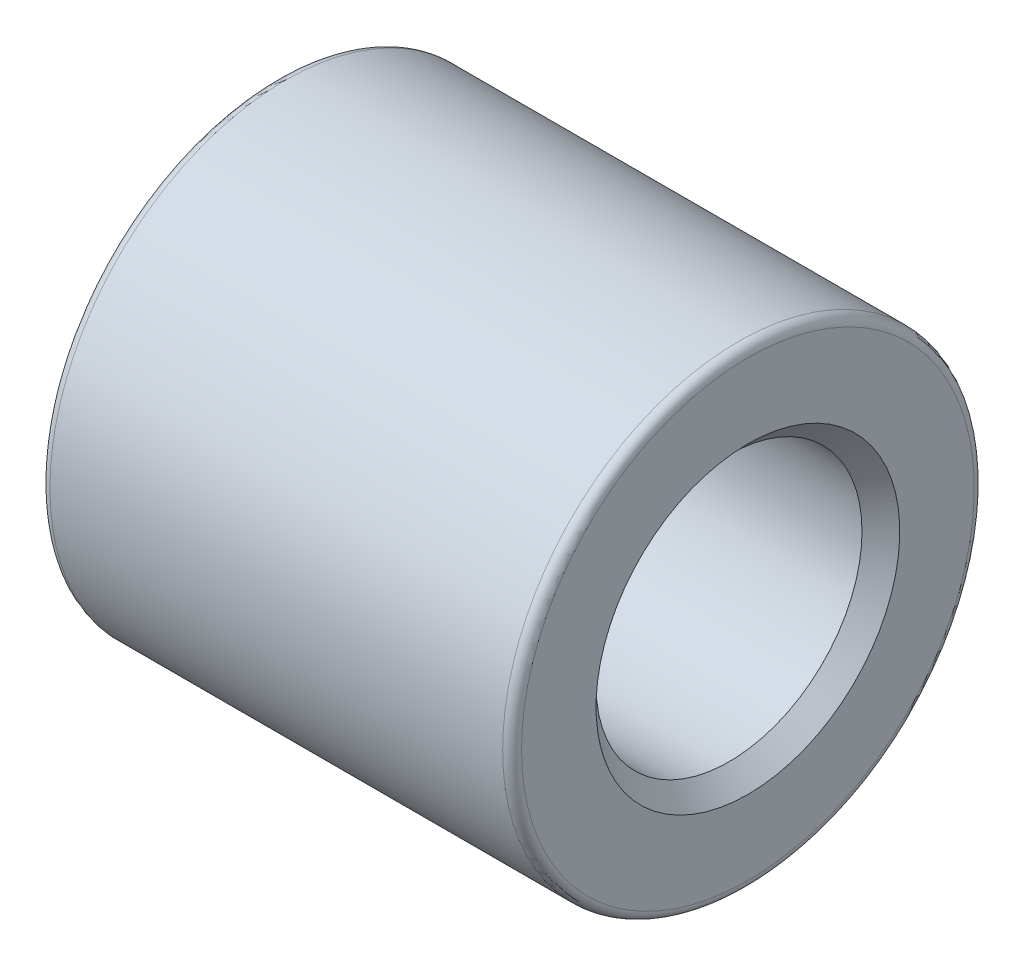
ISO-10303-21;
HEADER;
FILE_DESCRIPTION(('STEP AP214'),'2;1');
FILE_NAME('part.step','',(''),(''),'','','');
FILE_SCHEMA(('AUTOMOTIVE_DESIGN { 1 0 10303 214 1 1 1 1 }'));
ENDSEC;
DATA;
#1=APPLICATION_CONTEXT('core data for automotive mechanical design processes');
#2=APPLICATION_PROTOCOL_DEFINITION('international standard','automotive_design',2000,#1);
#3=PRODUCT_CONTEXT('',#1,'mechanical');
#4=PRODUCT('Part','Part','',(#3));
#5=PRODUCT_RELATED_PRODUCT_CATEGORY('part','',(#4));
#6=PRODUCT_DEFINITION_FORMATION('','',#4);
#7=PRODUCT_DEFINITION_CONTEXT('part definition',#1,'design');
#8=PRODUCT_DEFINITION('design','',#6,#7);
#9=PRODUCT_DEFINITION_SHAPE('','',#8);
#10=(LENGTH_UNIT() NAMED_UNIT(*) SI_UNIT(.MILLI.,.METRE.));
#11=(NAMED_UNIT(*) PLANE_ANGLE_UNIT() SI_UNIT($,.RADIAN.));
#12=(NAMED_UNIT(*) SI_UNIT($,.STERADIAN.) SOLID_ANGLE_UNIT());
#13=UNCERTAINTY_MEASURE_WITH_UNIT(LENGTH_MEASURE(1.E-05),#10,'distance_accuracy_value','');
#14=(GEOMETRIC_REPRESENTATION_CONTEXT(3) GLOBAL_UNCERTAINTY_ASSIGNED_CONTEXT((#13)) GLOBAL_UNIT_ASSIGNED_CONTEXT((#10,
#11,#12)) REPRESENTATION_CONTEXT('',''));
#15=CARTESIAN_POINT('',(0.,0.,0.));
#16=DIRECTION('',(0.,0.,1.));
#17=DIRECTION('',(1.,0.,0.));
#18=AXIS2_PLACEMENT_3D('',#15,#16,#17);
#19=CARTESIAN_POINT('',(0.,0.,0.));
#20=DIRECTION('',(-1.,0.,0.));
#21=DIRECTION('',(0.,0.,1.));
#22=AXIS2_PLACEMENT_3D('',#19,#20,#21);
#23=CYLINDRICAL_SURFACE('',#22,1.7907);
#24=CARTESIAN_POINT('',(0.253999999983989,0.,0.));
#25=DIRECTION('',(-1.,0.,0.));
#26=DIRECTION('',(0.,0.,1.));
#27=AXIS2_PLACEMENT_3D('',#24,#25,#26);
#28=CIRCLE('',#27,1.79069999995818);
#29=CARTESIAN_POINT('',(0.253999999983989,0.,1.79069999995818));
#30=VERTEX_POINT('',#29);
#31=EDGE_CURVE('E110',#30,#30,#28,.T.);
#32=ORIENTED_EDGE('',*,*,#31,.T.);
#33=EDGE_LOOP('',(#32));
#34=FACE_BOUND('',#33,.T.);
#35=CARTESIAN_POINT('',(6.09600000007049,0.,0.));
#36=DIRECTION('',(1.,0.,0.));
#37=DIRECTION('',(0.,0.,-1.));
#38=AXIS2_PLACEMENT_3D('',#35,#36,#37);
#39=CIRCLE('',#38,1.79070000001502);
#40=CARTESIAN_POINT('',(6.09600000007049,0.,-1.79070000001502));
#41=VERTEX_POINT('',#40);
#42=EDGE_CURVE('E114',#41,#41,#39,.T.);
#43=ORIENTED_EDGE('',*,*,#42,.T.);
#44=EDGE_LOOP('',(#43));
#45=FACE_BOUND('',#44,.T.);
#46=ADVANCED_FACE('F14',(#34,#45),#23,.F.);
#47=CARTESIAN_POINT('',(6.35000000005448,0.,0.));
#48=DIRECTION('',(1.,0.,0.));
#49=DIRECTION('',(0.,1.,0.));
#50=AXIS2_PLACEMENT_3D('',#47,#48,#49);
#51=CONICAL_SURFACE('',#50,2.04469999999901,0.785398163397448);
#52=CARTESIAN_POINT('',(6.35000000005448,0.,0.));
#53=DIRECTION('',(1.,0.,0.));
#54=DIRECTION('',(0.,1.,0.));
#55=AXIS2_PLACEMENT_3D('',#52,#53,#54);
#56=CIRCLE('',#55,2.04469999999901);
#57=CARTESIAN_POINT('',(6.35000000005448,2.04469999999901,0.));
#58=VERTEX_POINT('',#57);
#59=EDGE_CURVE('E17',#58,#58,#56,.T.);
#60=ORIENTED_EDGE('',*,*,#59,.T.);
#61=EDGE_LOOP('',(#60));
#62=FACE_BOUND('',#61,.T.);
#63=ORIENTED_EDGE('',*,*,#42,.F.);
#64=EDGE_LOOP('',(#63));
#65=FACE_BOUND('',#64,.T.);
#66=ADVANCED_FACE('F84',(#62,#65),#51,.F.);
#67=CARTESIAN_POINT('',(5.6843418860808E-11,0.,0.));
#68=DIRECTION('',(-1.,0.,0.));
#69=DIRECTION('',(0.,0.,1.));
#70=AXIS2_PLACEMENT_3D('',#67,#68,#69);
#71=CONICAL_SURFACE('',#70,2.04469999988532,0.785398163397448);
#72=CARTESIAN_POINT('',(0.,0.,0.));
#73=DIRECTION('',(-1.,0.,0.));
#74=DIRECTION('',(0.,0.,1.));
#75=AXIS2_PLACEMENT_3D('',#72,#73,#74);
#76=CIRCLE('',#75,2.04469999994217);
#77=CARTESIAN_POINT('',(0.,0.,2.04469999994217));
#78=VERTEX_POINT('',#77);
#79=EDGE_CURVE('E107',#78,#78,#76,.T.);
#80=ORIENTED_EDGE('',*,*,#79,.T.);
#81=EDGE_LOOP('',(#80));
#82=FACE_BOUND('',#81,.T.);
#83=ORIENTED_EDGE('',*,*,#31,.F.);
#84=EDGE_LOOP('',(#83));
#85=FACE_BOUND('',#84,.T.);
#86=ADVANCED_FACE('F80',(#82,#85),#71,.F.);
#87=CARTESIAN_POINT('',(6.35,3.175,0.));
#88=DIRECTION('',(-1.,0.,0.));
#89=DIRECTION('',(0.,0.,1.));
#90=AXIS2_PLACEMENT_3D('',#87,#88,#89);
#91=PLANE('',#90);
#92=ORIENTED_EDGE('',*,*,#59,.F.);
#93=EDGE_LOOP('',(#92));
#94=FACE_BOUND('',#93,.T.);
#95=CARTESIAN_POINT('',(6.35,0.,0.));
#96=DIRECTION('',(-1.,0.,0.));
#97=DIRECTION('',(0.,0.,1.));
#98=AXIS2_PLACEMENT_3D('',#95,#96,#97);
#99=CIRCLE('',#98,3.048);
#100=CARTESIAN_POINT('',(6.35,0.,3.048));
#101=VERTEX_POINT('',#100);
#102=EDGE_CURVE('E64',#101,#101,#99,.T.);
#103=ORIENTED_EDGE('',*,*,#102,.F.);
#104=EDGE_LOOP('',(#103));
#105=FACE_BOUND('',#104,.T.);
#106=ADVANCED_FACE('F70',(#94,#105),#91,.F.);
#107=CARTESIAN_POINT('',(0.,1.7907,0.));
#108=DIRECTION('',(1.,0.,0.));
#109=DIRECTION('',(0.,0.,-1.));
#110=AXIS2_PLACEMENT_3D('',#107,#108,#109);
#111=PLANE('',#110);
#112=ORIENTED_EDGE('',*,*,#79,.F.);
#113=EDGE_LOOP('',(#112));
#114=FACE_BOUND('',#113,.T.);
#115=CARTESIAN_POINT('',(0.,0.,0.));
#116=DIRECTION('',(1.,0.,0.));
#117=DIRECTION('',(0.,0.,-1.));
#118=AXIS2_PLACEMENT_3D('',#115,#116,#117);
#119=CIRCLE('',#118,3.048);
#120=CARTESIAN_POINT('',(0.,0.,-3.048));
#121=VERTEX_POINT('',#120);
#122=EDGE_CURVE('E26',#121,#121,#119,.T.);
#123=ORIENTED_EDGE('',*,*,#122,.F.);
#124=EDGE_LOOP('',(#123));
#125=FACE_BOUND('',#124,.T.);
#126=ADVANCED_FACE('F79',(#114,#125),#111,.F.);
#127=CARTESIAN_POINT('',(6.223,0.,0.));
#128=DIRECTION('',(-1.,0.,0.));
#129=DIRECTION('',(0.,0.,1.));
#130=AXIS2_PLACEMENT_3D('',#127,#128,#129);
#131=TOROIDAL_SURFACE('',#130,3.048,0.127);
#132=ORIENTED_EDGE('',*,*,#102,.T.);
#133=EDGE_LOOP('',(#132));
#134=FACE_BOUND('',#133,.T.);
#135=CARTESIAN_POINT('',(6.223,0.,0.));
#136=DIRECTION('',(-1.,0.,0.));
#137=DIRECTION('',(0.,0.,1.));
#138=AXIS2_PLACEMENT_3D('',#135,#136,#137);
#139=CIRCLE('',#138,3.175);
#140=CARTESIAN_POINT('',(6.223,0.,3.175));
#141=VERTEX_POINT('',#140);
#142=EDGE_CURVE('E21',#141,#141,#139,.T.);
#143=ORIENTED_EDGE('',*,*,#142,.F.);
#144=EDGE_LOOP('',(#143));
#145=FACE_BOUND('',#144,.T.);
#146=ADVANCED_FACE('F44',(#134,#145),#131,.T.);
#147=CARTESIAN_POINT('',(0.127,0.,0.));
#148=DIRECTION('',(1.,0.,0.));
#149=DIRECTION('',(0.,0.,-1.));
#150=AXIS2_PLACEMENT_3D('',#147,#148,#149);
#151=TOROIDAL_SURFACE('',#150,3.048,0.127);
#152=ORIENTED_EDGE('',*,*,#122,.T.);
#153=EDGE_LOOP('',(#152));
#154=FACE_BOUND('',#153,.T.);
#155=CARTESIAN_POINT('',(0.127,0.,0.));
#156=DIRECTION('',(-1.,0.,0.));
#157=DIRECTION('',(0.,0.,1.));
#158=AXIS2_PLACEMENT_3D('',#155,#156,#157);
#159=CIRCLE('',#158,3.175);
#160=CARTESIAN_POINT('',(0.127,0.,3.175));
#161=VERTEX_POINT('',#160);
#162=EDGE_CURVE('E10',#161,#161,#159,.F.);
#163=ORIENTED_EDGE('',*,*,#162,.F.);
#164=EDGE_LOOP('',(#163));
#165=FACE_BOUND('',#164,.T.);
#166=ADVANCED_FACE('F38',(#154,#165),#151,.T.);
#167=CARTESIAN_POINT('',(0.,0.,0.));
#168=DIRECTION('',(-1.,0.,0.));
#169=DIRECTION('',(0.,0.,1.));
#170=AXIS2_PLACEMENT_3D('',#167,#168,#169);
#171=CYLINDRICAL_SURFACE('',#170,3.175);
#172=ORIENTED_EDGE('',*,*,#162,.T.);
#173=EDGE_LOOP('',(#172));
#174=FACE_BOUND('',#173,.T.);
#175=ORIENTED_EDGE('',*,*,#142,.T.);
#176=EDGE_LOOP('',(#175));
#177=FACE_BOUND('',#176,.T.);
#178=ADVANCED_FACE('F43',(#174,#177),#171,.T.);
#179=CLOSED_SHELL('',(#46,#66,#86,#106,#126,#146,#166,#178));
#180=MANIFOLD_SOLID_BREP('B1',#179);
#181=ADVANCED_BREP_SHAPE_REPRESENTATION('',(#18,#180),#14);
#182=SHAPE_DEFINITION_REPRESENTATION(#9,#181);
ENDSEC;
END-ISO-10303-21;
